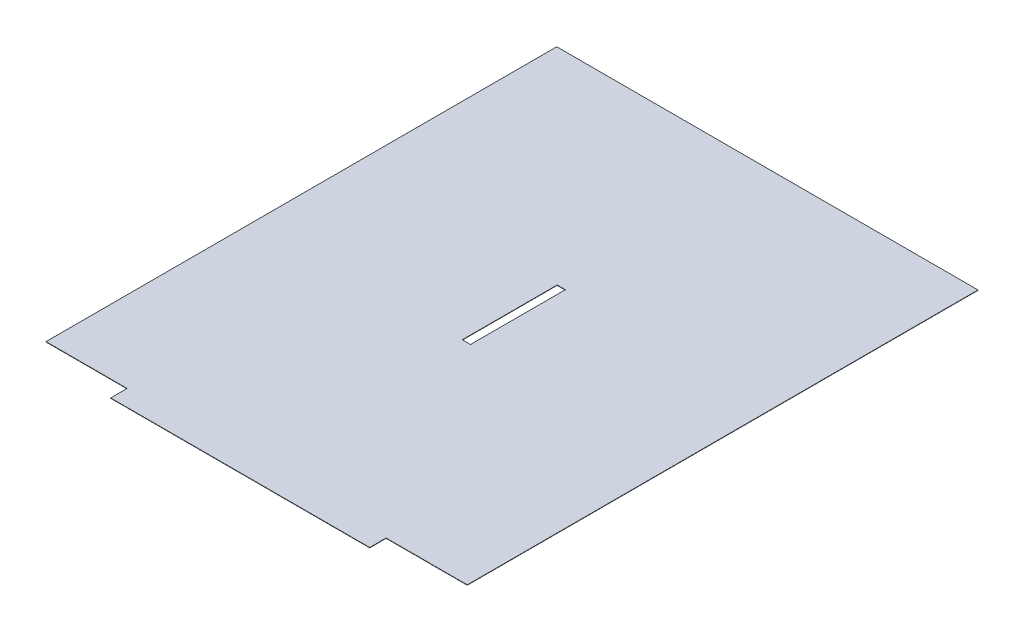
ISO-10303-21;
HEADER;
FILE_DESCRIPTION(('STEP AP214'),'2;1');
FILE_NAME('part.step','',(''),(''),'','','');
FILE_SCHEMA(('AUTOMOTIVE_DESIGN { 1 0 10303 214 1 1 1 1 }'));
ENDSEC;
DATA;
#1=APPLICATION_CONTEXT('core data for automotive mechanical design processes');
#2=APPLICATION_PROTOCOL_DEFINITION('international standard','automotive_design',2000,#1);
#3=PRODUCT_CONTEXT('',#1,'mechanical');
#4=PRODUCT('Part','Part','',(#3));
#5=PRODUCT_RELATED_PRODUCT_CATEGORY('part','',(#4));
#6=PRODUCT_DEFINITION_FORMATION('','',#4);
#7=PRODUCT_DEFINITION_CONTEXT('part definition',#1,'design');
#8=PRODUCT_DEFINITION('design','',#6,#7);
#9=PRODUCT_DEFINITION_SHAPE('','',#8);
#10=(LENGTH_UNIT() NAMED_UNIT(*) SI_UNIT(.MILLI.,.METRE.));
#11=(NAMED_UNIT(*) PLANE_ANGLE_UNIT() SI_UNIT($,.RADIAN.));
#12=(NAMED_UNIT(*) SI_UNIT($,.STERADIAN.) SOLID_ANGLE_UNIT());
#13=UNCERTAINTY_MEASURE_WITH_UNIT(LENGTH_MEASURE(1.E-05),#10,'distance_accuracy_value','');
#14=(GEOMETRIC_REPRESENTATION_CONTEXT(3) GLOBAL_UNCERTAINTY_ASSIGNED_CONTEXT((#13)) GLOBAL_UNIT_ASSIGNED_CONTEXT((#10,
#11,#12)) REPRESENTATION_CONTEXT('',''));
#15=CARTESIAN_POINT('',(0.,0.,0.));
#16=DIRECTION('',(0.,0.,1.));
#17=DIRECTION('',(1.,0.,0.));
#18=AXIS2_PLACEMENT_3D('',#15,#16,#17);
#19=CARTESIAN_POINT('',(115.475,61.2,141.));
#20=DIRECTION('',(0.,0.,-1.));
#21=DIRECTION('',(-1.,0.,0.));
#22=AXIS2_PLACEMENT_3D('',#19,#20,#21);
#23=PLANE('',#22);
#24=DIRECTION('',(1.,0.,0.));
#25=VECTOR('',#24,1.);
#26=CARTESIAN_POINT('',(115.475,61.,141.));
#27=LINE('',#26,#25);
#28=CARTESIAN_POINT('',(71.,61.,141.));
#29=VERTEX_POINT('',#28);
#30=CARTESIAN_POINT('',(115.475,61.,141.));
#31=VERTEX_POINT('',#30);
#32=EDGE_CURVE('E156',#29,#31,#27,.T.);
#33=ORIENTED_EDGE('',*,*,#32,.T.);
#34=DIRECTION('',(0.,-1.,0.));
#35=VECTOR('',#34,1.);
#36=CARTESIAN_POINT('',(115.475,61.2,141.));
#37=LINE('',#36,#35);
#38=CARTESIAN_POINT('',(115.475,61.2,141.));
#39=VERTEX_POINT('',#38);
#40=EDGE_CURVE('E213',#39,#31,#37,.T.);
#41=ORIENTED_EDGE('',*,*,#40,.F.);
#42=DIRECTION('',(1.,0.,0.));
#43=VECTOR('',#42,1.);
#44=CARTESIAN_POINT('',(115.475,61.2,141.));
#45=LINE('',#44,#43);
#46=CARTESIAN_POINT('',(71.,61.2,141.));
#47=VERTEX_POINT('',#46);
#48=EDGE_CURVE('E159',#47,#39,#45,.T.);
#49=ORIENTED_EDGE('',*,*,#48,.F.);
#50=DIRECTION('',(0.,-1.,0.));
#51=VECTOR('',#50,1.);
#52=CARTESIAN_POINT('',(71.,61.2,141.));
#53=LINE('',#52,#51);
#54=EDGE_CURVE('E177',#47,#29,#53,.T.);
#55=ORIENTED_EDGE('',*,*,#54,.T.);
#56=EDGE_LOOP('',(#33,#41,#49,#55));
#57=FACE_BOUND('',#56,.T.);
#58=ADVANCED_FACE('F43',(#57),#23,.F.);
#59=CARTESIAN_POINT('',(115.475,61.2,141.));
#60=DIRECTION('',(-1.,0.,0.));
#61=DIRECTION('',(0.,0.,1.));
#62=AXIS2_PLACEMENT_3D('',#59,#60,#61);
#63=PLANE('',#62);
#64=DIRECTION('',(0.,0.,-1.));
#65=VECTOR('',#64,1.);
#66=CARTESIAN_POINT('',(115.475,61.,141.));
#67=LINE('',#66,#65);
#68=CARTESIAN_POINT('',(115.475,61.,-139.));
#69=VERTEX_POINT('',#68);
#70=EDGE_CURVE('E180',#31,#69,#67,.T.);
#71=ORIENTED_EDGE('',*,*,#70,.T.);
#72=DIRECTION('',(0.,-1.,0.));
#73=VECTOR('',#72,1.);
#74=CARTESIAN_POINT('',(115.475,61.2,-139.));
#75=LINE('',#74,#73);
#76=CARTESIAN_POINT('',(115.475,61.2,-139.));
#77=VERTEX_POINT('',#76);
#78=EDGE_CURVE('E210',#77,#69,#75,.T.);
#79=ORIENTED_EDGE('',*,*,#78,.F.);
#80=DIRECTION('',(0.,0.,-1.));
#81=VECTOR('',#80,1.);
#82=CARTESIAN_POINT('',(115.475,61.2,141.));
#83=LINE('',#82,#81);
#84=EDGE_CURVE('E162',#39,#77,#83,.T.);
#85=ORIENTED_EDGE('',*,*,#84,.F.);
#86=ORIENTED_EDGE('',*,*,#40,.T.);
#87=EDGE_LOOP('',(#71,#79,#85,#86));
#88=FACE_BOUND('',#87,.T.);
#89=ADVANCED_FACE('F238',(#88),#63,.F.);
#90=CARTESIAN_POINT('',(-115.475,61.2,-139.));
#91=DIRECTION('',(0.,0.,1.));
#92=DIRECTION('',(1.,0.,0.));
#93=AXIS2_PLACEMENT_3D('',#90,#91,#92);
#94=PLANE('',#93);
#95=DIRECTION('',(-1.,0.,0.));
#96=VECTOR('',#95,1.);
#97=CARTESIAN_POINT('',(-115.475,61.,-139.));
#98=LINE('',#97,#96);
#99=CARTESIAN_POINT('',(-115.475,61.,-139.));
#100=VERTEX_POINT('',#99);
#101=EDGE_CURVE('E182',#69,#100,#98,.T.);
#102=ORIENTED_EDGE('',*,*,#101,.T.);
#103=DIRECTION('',(0.,-1.,0.));
#104=VECTOR('',#103,1.);
#105=CARTESIAN_POINT('',(-115.475,61.2,-139.));
#106=LINE('',#105,#104);
#107=CARTESIAN_POINT('',(-115.475,61.2,-139.));
#108=VERTEX_POINT('',#107);
#109=EDGE_CURVE('E207',#108,#100,#106,.T.);
#110=ORIENTED_EDGE('',*,*,#109,.F.);
#111=DIRECTION('',(-1.,0.,0.));
#112=VECTOR('',#111,1.);
#113=CARTESIAN_POINT('',(-115.475,61.2,-139.));
#114=LINE('',#113,#112);
#115=EDGE_CURVE('E165',#77,#108,#114,.T.);
#116=ORIENTED_EDGE('',*,*,#115,.F.);
#117=ORIENTED_EDGE('',*,*,#78,.T.);
#118=EDGE_LOOP('',(#102,#110,#116,#117));
#119=FACE_BOUND('',#118,.T.);
#120=ADVANCED_FACE('F243',(#119),#94,.F.);
#121=CARTESIAN_POINT('',(-115.475,61.2,141.));
#122=DIRECTION('',(1.,0.,0.));
#123=DIRECTION('',(0.,0.,-1.));
#124=AXIS2_PLACEMENT_3D('',#121,#122,#123);
#125=PLANE('',#124);
#126=DIRECTION('',(0.,0.,1.));
#127=VECTOR('',#126,1.);
#128=CARTESIAN_POINT('',(-115.475,61.,141.));
#129=LINE('',#128,#127);
#130=CARTESIAN_POINT('',(-115.475,61.,141.));
#131=VERTEX_POINT('',#130);
#132=EDGE_CURVE('E184',#100,#131,#129,.T.);
#133=ORIENTED_EDGE('',*,*,#132,.T.);
#134=DIRECTION('',(0.,-1.,0.));
#135=VECTOR('',#134,1.);
#136=CARTESIAN_POINT('',(-115.475,61.2,141.));
#137=LINE('',#136,#135);
#138=CARTESIAN_POINT('',(-115.475,61.2,141.));
#139=VERTEX_POINT('',#138);
#140=EDGE_CURVE('E204',#139,#131,#137,.T.);
#141=ORIENTED_EDGE('',*,*,#140,.F.);
#142=DIRECTION('',(0.,0.,1.));
#143=VECTOR('',#142,1.);
#144=CARTESIAN_POINT('',(-115.475,61.2,141.));
#145=LINE('',#144,#143);
#146=EDGE_CURVE('E167',#108,#139,#145,.T.);
#147=ORIENTED_EDGE('',*,*,#146,.F.);
#148=ORIENTED_EDGE('',*,*,#109,.T.);
#149=EDGE_LOOP('',(#133,#141,#147,#148));
#150=FACE_BOUND('',#149,.T.);
#151=ADVANCED_FACE('F275',(#150),#125,.F.);
#152=CARTESIAN_POINT('',(-115.475,61.2,141.));
#153=DIRECTION('',(0.,0.,-1.));
#154=DIRECTION('',(-1.,0.,0.));
#155=AXIS2_PLACEMENT_3D('',#152,#153,#154);
#156=PLANE('',#155);
#157=DIRECTION('',(1.,0.,0.));
#158=VECTOR('',#157,1.);
#159=CARTESIAN_POINT('',(-115.475,61.,141.));
#160=LINE('',#159,#158);
#161=CARTESIAN_POINT('',(-71.,61.,141.));
#162=VERTEX_POINT('',#161);
#163=EDGE_CURVE('E186',#131,#162,#160,.T.);
#164=ORIENTED_EDGE('',*,*,#163,.T.);
#165=DIRECTION('',(0.,-1.,0.));
#166=VECTOR('',#165,1.);
#167=CARTESIAN_POINT('',(-71.,61.2,141.));
#168=LINE('',#167,#166);
#169=CARTESIAN_POINT('',(-71.,61.2,141.));
#170=VERTEX_POINT('',#169);
#171=EDGE_CURVE('E201',#170,#162,#168,.T.);
#172=ORIENTED_EDGE('',*,*,#171,.F.);
#173=DIRECTION('',(1.,0.,0.));
#174=VECTOR('',#173,1.);
#175=CARTESIAN_POINT('',(-115.475,61.2,141.));
#176=LINE('',#175,#174);
#177=EDGE_CURVE('E169',#139,#170,#176,.T.);
#178=ORIENTED_EDGE('',*,*,#177,.F.);
#179=ORIENTED_EDGE('',*,*,#140,.T.);
#180=EDGE_LOOP('',(#164,#172,#178,#179));
#181=FACE_BOUND('',#180,.T.);
#182=ADVANCED_FACE('F271',(#181),#156,.F.);
#183=CARTESIAN_POINT('',(-71.,61.2,150.));
#184=DIRECTION('',(1.,0.,0.));
#185=DIRECTION('',(0.,0.,-1.));
#186=AXIS2_PLACEMENT_3D('',#183,#184,#185);
#187=PLANE('',#186);
#188=DIRECTION('',(0.,0.,1.));
#189=VECTOR('',#188,1.);
#190=CARTESIAN_POINT('',(-71.,61.,150.));
#191=LINE('',#190,#189);
#192=CARTESIAN_POINT('',(-71.,61.,150.));
#193=VERTEX_POINT('',#192);
#194=EDGE_CURVE('E188',#162,#193,#191,.T.);
#195=ORIENTED_EDGE('',*,*,#194,.T.);
#196=DIRECTION('',(0.,-1.,0.));
#197=VECTOR('',#196,1.);
#198=CARTESIAN_POINT('',(-71.,61.2,150.));
#199=LINE('',#198,#197);
#200=CARTESIAN_POINT('',(-71.,61.2,150.));
#201=VERTEX_POINT('',#200);
#202=EDGE_CURVE('E198',#201,#193,#199,.T.);
#203=ORIENTED_EDGE('',*,*,#202,.F.);
#204=DIRECTION('',(0.,0.,1.));
#205=VECTOR('',#204,1.);
#206=CARTESIAN_POINT('',(-71.,61.2,150.));
#207=LINE('',#206,#205);
#208=EDGE_CURVE('E171',#170,#201,#207,.T.);
#209=ORIENTED_EDGE('',*,*,#208,.F.);
#210=ORIENTED_EDGE('',*,*,#171,.T.);
#211=EDGE_LOOP('',(#195,#203,#209,#210));
#212=FACE_BOUND('',#211,.T.);
#213=ADVANCED_FACE('F266',(#212),#187,.F.);
#214=CARTESIAN_POINT('',(-71.,61.2,150.));
#215=DIRECTION('',(0.,0.,-1.));
#216=DIRECTION('',(-1.,0.,0.));
#217=AXIS2_PLACEMENT_3D('',#214,#215,#216);
#218=PLANE('',#217);
#219=DIRECTION('',(1.,0.,0.));
#220=VECTOR('',#219,1.);
#221=CARTESIAN_POINT('',(-71.,61.,150.));
#222=LINE('',#221,#220);
#223=CARTESIAN_POINT('',(71.,61.,150.));
#224=VERTEX_POINT('',#223);
#225=EDGE_CURVE('E190',#193,#224,#222,.T.);
#226=ORIENTED_EDGE('',*,*,#225,.T.);
#227=DIRECTION('',(0.,-1.,0.));
#228=VECTOR('',#227,1.);
#229=CARTESIAN_POINT('',(71.,61.2,150.));
#230=LINE('',#229,#228);
#231=CARTESIAN_POINT('',(71.,61.2,150.));
#232=VERTEX_POINT('',#231);
#233=EDGE_CURVE('E195',#232,#224,#230,.T.);
#234=ORIENTED_EDGE('',*,*,#233,.F.);
#235=DIRECTION('',(1.,0.,0.));
#236=VECTOR('',#235,1.);
#237=CARTESIAN_POINT('',(-71.,61.2,150.));
#238=LINE('',#237,#236);
#239=EDGE_CURVE('E173',#201,#232,#238,.T.);
#240=ORIENTED_EDGE('',*,*,#239,.F.);
#241=ORIENTED_EDGE('',*,*,#202,.T.);
#242=EDGE_LOOP('',(#226,#234,#240,#241));
#243=FACE_BOUND('',#242,.T.);
#244=ADVANCED_FACE('F261',(#243),#218,.F.);
#245=CARTESIAN_POINT('',(71.,61.2,150.));
#246=DIRECTION('',(-1.,0.,0.));
#247=DIRECTION('',(0.,0.,1.));
#248=AXIS2_PLACEMENT_3D('',#245,#246,#247);
#249=PLANE('',#248);
#250=DIRECTION('',(0.,0.,-1.));
#251=VECTOR('',#250,1.);
#252=CARTESIAN_POINT('',(71.,61.,150.));
#253=LINE('',#252,#251);
#254=EDGE_CURVE('E163',#224,#29,#253,.T.);
#255=ORIENTED_EDGE('',*,*,#254,.T.);
#256=ORIENTED_EDGE('',*,*,#54,.F.);
#257=DIRECTION('',(0.,0.,-1.));
#258=VECTOR('',#257,1.);
#259=CARTESIAN_POINT('',(71.,61.2,150.));
#260=LINE('',#259,#258);
#261=EDGE_CURVE('E175',#232,#47,#260,.T.);
#262=ORIENTED_EDGE('',*,*,#261,.F.);
#263=ORIENTED_EDGE('',*,*,#233,.T.);
#264=EDGE_LOOP('',(#255,#256,#262,#263));
#265=FACE_BOUND('',#264,.T.);
#266=ADVANCED_FACE('F259',(#265),#249,.F.);
#267=CARTESIAN_POINT('',(0.,61.2,0.));
#268=DIRECTION('',(0.,-1.,0.));
#269=DIRECTION('',(0.,0.,-1.));
#270=AXIS2_PLACEMENT_3D('',#267,#268,#269);
#271=PLANE('',#270);
#272=DIRECTION('',(-1.,0.,0.));
#273=VECTOR('',#272,1.);
#274=CARTESIAN_POINT('',(-2.25,61.2,-26.));
#275=LINE('',#274,#273);
#276=CARTESIAN_POINT('',(2.25,61.2,-26.));
#277=VERTEX_POINT('',#276);
#278=CARTESIAN_POINT('',(-2.25,61.2,-26.));
#279=VERTEX_POINT('',#278);
#280=EDGE_CURVE('E142',#277,#279,#275,.T.);
#281=ORIENTED_EDGE('',*,*,#280,.F.);
#282=DIRECTION('',(0.,0.,-1.));
#283=VECTOR('',#282,1.);
#284=CARTESIAN_POINT('',(2.25,61.2,-26.));
#285=LINE('',#284,#283);
#286=CARTESIAN_POINT('',(2.25,61.2,26.));
#287=VERTEX_POINT('',#286);
#288=EDGE_CURVE('E57',#287,#277,#285,.T.);
#289=ORIENTED_EDGE('',*,*,#288,.F.);
#290=DIRECTION('',(1.,0.,0.));
#291=VECTOR('',#290,1.);
#292=CARTESIAN_POINT('',(-2.25,61.2,26.));
#293=LINE('',#292,#291);
#294=CARTESIAN_POINT('',(-2.25,61.2,26.));
#295=VERTEX_POINT('',#294);
#296=EDGE_CURVE('E149',#295,#287,#293,.T.);
#297=ORIENTED_EDGE('',*,*,#296,.F.);
#298=DIRECTION('',(0.,0.,1.));
#299=VECTOR('',#298,1.);
#300=CARTESIAN_POINT('',(-2.25,61.2,-26.));
#301=LINE('',#300,#299);
#302=EDGE_CURVE('E133',#279,#295,#301,.T.);
#303=ORIENTED_EDGE('',*,*,#302,.F.);
#304=EDGE_LOOP('',(#281,#289,#297,#303));
#305=FACE_BOUND('',#304,.T.);
#306=ORIENTED_EDGE('',*,*,#48,.T.);
#307=ORIENTED_EDGE('',*,*,#84,.T.);
#308=ORIENTED_EDGE('',*,*,#115,.T.);
#309=ORIENTED_EDGE('',*,*,#146,.T.);
#310=ORIENTED_EDGE('',*,*,#177,.T.);
#311=ORIENTED_EDGE('',*,*,#208,.T.);
#312=ORIENTED_EDGE('',*,*,#239,.T.);
#313=ORIENTED_EDGE('',*,*,#261,.T.);
#314=EDGE_LOOP('',(#306,#307,#308,#309,#310,#311,#312,#313));
#315=FACE_BOUND('',#314,.T.);
#316=ADVANCED_FACE('F146',(#305,#315),#271,.F.);
#317=CARTESIAN_POINT('',(0.,61.,0.));
#318=DIRECTION('',(0.,-1.,0.));
#319=DIRECTION('',(0.,0.,-1.));
#320=AXIS2_PLACEMENT_3D('',#317,#318,#319);
#321=PLANE('',#320);
#322=DIRECTION('',(0.,0.,1.));
#323=VECTOR('',#322,1.);
#324=CARTESIAN_POINT('',(2.25,61.,0.));
#325=LINE('',#324,#323);
#326=CARTESIAN_POINT('',(2.25,61.,-26.));
#327=VERTEX_POINT('',#326);
#328=CARTESIAN_POINT('',(2.25,61.,26.));
#329=VERTEX_POINT('',#328);
#330=EDGE_CURVE('E11',#327,#329,#325,.T.);
#331=ORIENTED_EDGE('',*,*,#330,.F.);
#332=DIRECTION('',(1.,0.,0.));
#333=VECTOR('',#332,1.);
#334=CARTESIAN_POINT('',(0.,61.,-26.));
#335=LINE('',#334,#333);
#336=CARTESIAN_POINT('',(-2.25,61.,-26.));
#337=VERTEX_POINT('',#336);
#338=EDGE_CURVE('E216',#337,#327,#335,.T.);
#339=ORIENTED_EDGE('',*,*,#338,.F.);
#340=DIRECTION('',(0.,0.,-1.));
#341=VECTOR('',#340,1.);
#342=CARTESIAN_POINT('',(-2.25,61.,0.));
#343=LINE('',#342,#341);
#344=CARTESIAN_POINT('',(-2.25,61.,26.));
#345=VERTEX_POINT('',#344);
#346=EDGE_CURVE('E136',#345,#337,#343,.T.);
#347=ORIENTED_EDGE('',*,*,#346,.F.);
#348=DIRECTION('',(-1.,0.,0.));
#349=VECTOR('',#348,1.);
#350=CARTESIAN_POINT('',(0.,61.,26.));
#351=LINE('',#350,#349);
#352=EDGE_CURVE('E50',#329,#345,#351,.T.);
#353=ORIENTED_EDGE('',*,*,#352,.F.);
#354=EDGE_LOOP('',(#331,#339,#347,#353));
#355=FACE_BOUND('',#354,.T.);
#356=ORIENTED_EDGE('',*,*,#32,.F.);
#357=ORIENTED_EDGE('',*,*,#254,.F.);
#358=ORIENTED_EDGE('',*,*,#225,.F.);
#359=ORIENTED_EDGE('',*,*,#194,.F.);
#360=ORIENTED_EDGE('',*,*,#163,.F.);
#361=ORIENTED_EDGE('',*,*,#132,.F.);
#362=ORIENTED_EDGE('',*,*,#101,.F.);
#363=ORIENTED_EDGE('',*,*,#70,.F.);
#364=EDGE_LOOP('',(#356,#357,#358,#359,#360,#361,#362,#363));
#365=FACE_BOUND('',#364,.T.);
#366=ADVANCED_FACE('F224',(#355,#365),#321,.T.);
#367=CARTESIAN_POINT('',(2.25,51.2,-26.));
#368=DIRECTION('',(1.,0.,0.));
#369=DIRECTION('',(0.,0.,-1.));
#370=AXIS2_PLACEMENT_3D('',#367,#368,#369);
#371=PLANE('',#370);
#372=ORIENTED_EDGE('',*,*,#330,.T.);
#373=DIRECTION('',(0.,1.,0.));
#374=VECTOR('',#373,1.);
#375=CARTESIAN_POINT('',(2.25,51.2,26.));
#376=LINE('',#375,#374);
#377=EDGE_CURVE('E154',#329,#287,#376,.T.);
#378=ORIENTED_EDGE('',*,*,#377,.T.);
#379=ORIENTED_EDGE('',*,*,#288,.T.);
#380=DIRECTION('',(0.,1.,0.));
#381=VECTOR('',#380,1.);
#382=CARTESIAN_POINT('',(2.25,51.2,-26.));
#383=LINE('',#382,#381);
#384=EDGE_CURVE('E139',#327,#277,#383,.T.);
#385=ORIENTED_EDGE('',*,*,#384,.F.);
#386=EDGE_LOOP('',(#372,#378,#379,#385));
#387=FACE_BOUND('',#386,.T.);
#388=ADVANCED_FACE('F226',(#387),#371,.F.);
#389=CARTESIAN_POINT('',(-2.25,51.2,26.));
#390=DIRECTION('',(0.,0.,1.));
#391=DIRECTION('',(1.,0.,0.));
#392=AXIS2_PLACEMENT_3D('',#389,#390,#391);
#393=PLANE('',#392);
#394=ORIENTED_EDGE('',*,*,#352,.T.);
#395=DIRECTION('',(0.,1.,0.));
#396=VECTOR('',#395,1.);
#397=CARTESIAN_POINT('',(-2.25,51.2,26.));
#398=LINE('',#397,#396);
#399=EDGE_CURVE('E138',#345,#295,#398,.T.);
#400=ORIENTED_EDGE('',*,*,#399,.T.);
#401=ORIENTED_EDGE('',*,*,#296,.T.);
#402=ORIENTED_EDGE('',*,*,#377,.F.);
#403=EDGE_LOOP('',(#394,#400,#401,#402));
#404=FACE_BOUND('',#403,.T.);
#405=ADVANCED_FACE('F221',(#404),#393,.F.);
#406=CARTESIAN_POINT('',(-2.25,51.2,-26.));
#407=DIRECTION('',(-1.,0.,0.));
#408=DIRECTION('',(0.,0.,1.));
#409=AXIS2_PLACEMENT_3D('',#406,#407,#408);
#410=PLANE('',#409);
#411=ORIENTED_EDGE('',*,*,#346,.T.);
#412=DIRECTION('',(0.,1.,0.));
#413=VECTOR('',#412,1.);
#414=CARTESIAN_POINT('',(-2.25,51.2,-26.));
#415=LINE('',#414,#413);
#416=EDGE_CURVE('E65',#337,#279,#415,.T.);
#417=ORIENTED_EDGE('',*,*,#416,.T.);
#418=ORIENTED_EDGE('',*,*,#302,.T.);
#419=ORIENTED_EDGE('',*,*,#399,.F.);
#420=EDGE_LOOP('',(#411,#417,#418,#419));
#421=FACE_BOUND('',#420,.T.);
#422=ADVANCED_FACE('F130',(#421),#410,.F.);
#423=CARTESIAN_POINT('',(-2.25,51.2,-26.));
#424=DIRECTION('',(0.,0.,-1.));
#425=DIRECTION('',(-1.,0.,0.));
#426=AXIS2_PLACEMENT_3D('',#423,#424,#425);
#427=PLANE('',#426);
#428=ORIENTED_EDGE('',*,*,#338,.T.);
#429=ORIENTED_EDGE('',*,*,#384,.T.);
#430=ORIENTED_EDGE('',*,*,#280,.T.);
#431=ORIENTED_EDGE('',*,*,#416,.F.);
#432=EDGE_LOOP('',(#428,#429,#430,#431));
#433=FACE_BOUND('',#432,.T.);
#434=ADVANCED_FACE('F143',(#433),#427,.F.);
#435=CLOSED_SHELL('',(#58,#89,#120,#151,#182,#213,#244,#266,#316,#366,#388,#405,#422,#434));
#436=MANIFOLD_SOLID_BREP('B2',#435);
#437=ADVANCED_BREP_SHAPE_REPRESENTATION('',(#18,#436),#14);
#438=SHAPE_DEFINITION_REPRESENTATION(#9,#437);
ENDSEC;
END-ISO-10303-21;
